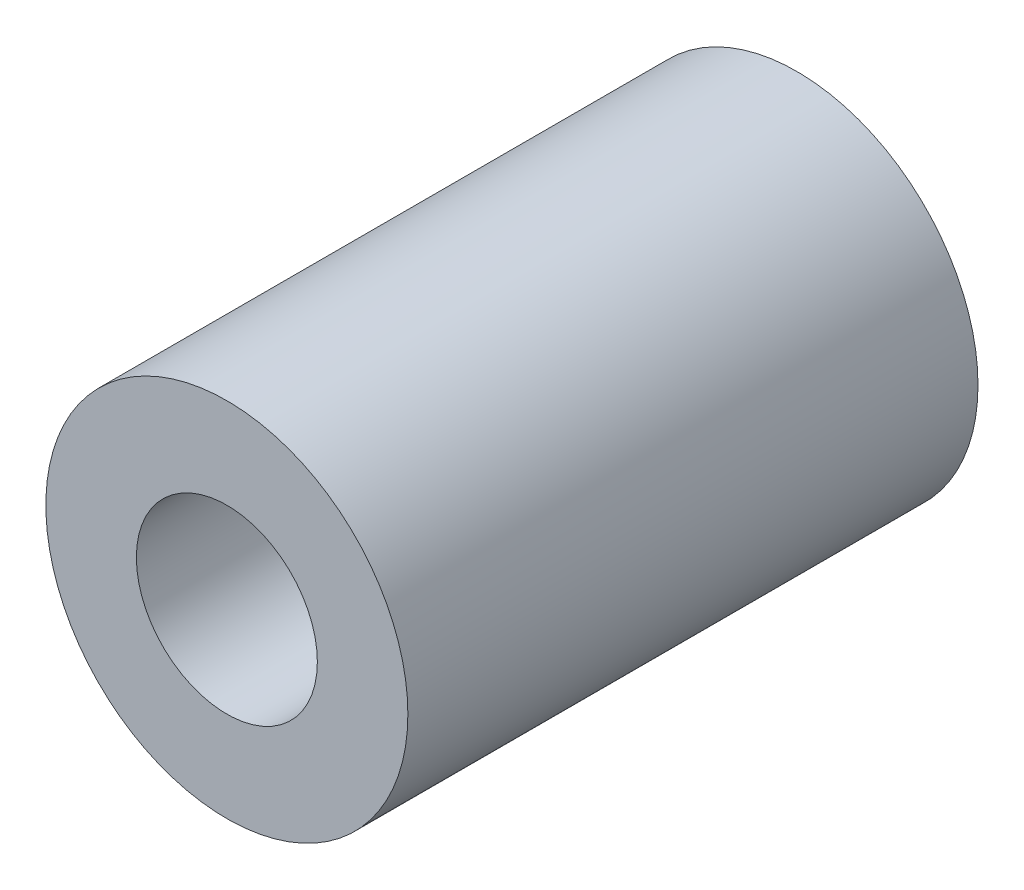
ISO-10303-21;
HEADER;
FILE_DESCRIPTION(('STEP AP214'),'2;1');
FILE_NAME('part.step','',(''),(''),'','','');
FILE_SCHEMA(('AUTOMOTIVE_DESIGN { 1 0 10303 214 1 1 1 1 }'));
ENDSEC;
DATA;
#1=APPLICATION_CONTEXT('core data for automotive mechanical design processes');
#2=APPLICATION_PROTOCOL_DEFINITION('international standard','automotive_design',2000,#1);
#3=PRODUCT_CONTEXT('',#1,'mechanical');
#4=PRODUCT('Part','Part','',(#3));
#5=PRODUCT_RELATED_PRODUCT_CATEGORY('part','',(#4));
#6=PRODUCT_DEFINITION_FORMATION('','',#4);
#7=PRODUCT_DEFINITION_CONTEXT('part definition',#1,'design');
#8=PRODUCT_DEFINITION('design','',#6,#7);
#9=PRODUCT_DEFINITION_SHAPE('','',#8);
#10=(LENGTH_UNIT() NAMED_UNIT(*) SI_UNIT(.MILLI.,.METRE.));
#11=(NAMED_UNIT(*) PLANE_ANGLE_UNIT() SI_UNIT($,.RADIAN.));
#12=(NAMED_UNIT(*) SI_UNIT($,.STERADIAN.) SOLID_ANGLE_UNIT());
#13=UNCERTAINTY_MEASURE_WITH_UNIT(LENGTH_MEASURE(1.E-05),#10,'distance_accuracy_value','');
#14=(GEOMETRIC_REPRESENTATION_CONTEXT(3) GLOBAL_UNCERTAINTY_ASSIGNED_CONTEXT((#13)) GLOBAL_UNIT_ASSIGNED_CONTEXT((#10,
#11,#12)) REPRESENTATION_CONTEXT('',''));
#15=CARTESIAN_POINT('',(0.,0.,0.));
#16=DIRECTION('',(0.,0.,1.));
#17=DIRECTION('',(1.,0.,0.));
#18=AXIS2_PLACEMENT_3D('',#15,#16,#17);
#19=CARTESIAN_POINT('',(0.,0.,10.));
#20=DIRECTION('',(0.,0.,1.));
#21=DIRECTION('',(1.,0.,0.));
#22=AXIS2_PLACEMENT_3D('',#19,#20,#21);
#23=PLANE('',#22);
#24=CARTESIAN_POINT('',(0.,0.,10.));
#25=DIRECTION('',(0.,0.,1.));
#26=DIRECTION('',(1.,0.,0.));
#27=AXIS2_PLACEMENT_3D('',#24,#25,#26);
#28=CIRCLE('',#27,3.175);
#29=CARTESIAN_POINT('',(3.175,0.,10.));
#30=VERTEX_POINT('',#29);
#31=EDGE_CURVE('E10',#30,#30,#28,.T.);
#32=ORIENTED_EDGE('',*,*,#31,.T.);
#33=EDGE_LOOP('',(#32));
#34=FACE_BOUND('',#33,.T.);
#35=CARTESIAN_POINT('',(0.,0.,10.));
#36=DIRECTION('',(0.,0.,1.));
#37=DIRECTION('',(1.,0.,0.));
#38=AXIS2_PLACEMENT_3D('',#35,#36,#37);
#39=CIRCLE('',#38,1.5875);
#40=CARTESIAN_POINT('',(1.5875,0.,10.));
#41=VERTEX_POINT('',#40);
#42=EDGE_CURVE('E41',#41,#41,#39,.T.);
#43=ORIENTED_EDGE('',*,*,#42,.F.);
#44=EDGE_LOOP('',(#43));
#45=FACE_BOUND('',#44,.T.);
#46=ADVANCED_FACE('F30',(#34,#45),#23,.T.);
#47=CARTESIAN_POINT('',(0.,0.,0.));
#48=DIRECTION('',(0.,0.,1.));
#49=DIRECTION('',(1.,0.,0.));
#50=AXIS2_PLACEMENT_3D('',#47,#48,#49);
#51=PLANE('',#50);
#52=CARTESIAN_POINT('',(0.,0.,0.));
#53=DIRECTION('',(0.,0.,1.));
#54=DIRECTION('',(1.,0.,0.));
#55=AXIS2_PLACEMENT_3D('',#52,#53,#54);
#56=CIRCLE('',#55,3.175);
#57=CARTESIAN_POINT('',(3.175,0.,0.));
#58=VERTEX_POINT('',#57);
#59=EDGE_CURVE('E34',#58,#58,#56,.T.);
#60=ORIENTED_EDGE('',*,*,#59,.F.);
#61=EDGE_LOOP('',(#60));
#62=FACE_BOUND('',#61,.T.);
#63=CARTESIAN_POINT('',(0.,0.,0.));
#64=DIRECTION('',(0.,0.,1.));
#65=DIRECTION('',(1.,0.,0.));
#66=AXIS2_PLACEMENT_3D('',#63,#64,#65);
#67=CIRCLE('',#66,1.5875);
#68=CARTESIAN_POINT('',(1.5875,0.,0.));
#69=VERTEX_POINT('',#68);
#70=EDGE_CURVE('E43',#69,#69,#67,.T.);
#71=ORIENTED_EDGE('',*,*,#70,.T.);
#72=EDGE_LOOP('',(#71));
#73=FACE_BOUND('',#72,.T.);
#74=ADVANCED_FACE('F53',(#62,#73),#51,.F.);
#75=CARTESIAN_POINT('',(0.,0.,10.));
#76=DIRECTION('',(0.,0.,-1.));
#77=DIRECTION('',(-1.,0.,0.));
#78=AXIS2_PLACEMENT_3D('',#75,#76,#77);
#79=CYLINDRICAL_SURFACE('',#78,3.175);
#80=ORIENTED_EDGE('',*,*,#31,.F.);
#81=EDGE_LOOP('',(#80));
#82=FACE_BOUND('',#81,.T.);
#83=ORIENTED_EDGE('',*,*,#59,.T.);
#84=EDGE_LOOP('',(#83));
#85=FACE_BOUND('',#84,.T.);
#86=ADVANCED_FACE('F32',(#82,#85),#79,.T.);
#87=CARTESIAN_POINT('',(0.,0.,10.));
#88=DIRECTION('',(0.,0.,-1.));
#89=DIRECTION('',(-1.,0.,0.));
#90=AXIS2_PLACEMENT_3D('',#87,#88,#89);
#91=CYLINDRICAL_SURFACE('',#90,1.5875);
#92=ORIENTED_EDGE('',*,*,#42,.T.);
#93=EDGE_LOOP('',(#92));
#94=FACE_BOUND('',#93,.T.);
#95=ORIENTED_EDGE('',*,*,#70,.F.);
#96=EDGE_LOOP('',(#95));
#97=FACE_BOUND('',#96,.T.);
#98=ADVANCED_FACE('F49',(#94,#97),#91,.F.);
#99=CLOSED_SHELL('',(#46,#74,#86,#98));
#100=MANIFOLD_SOLID_BREP('B2',#99);
#101=ADVANCED_BREP_SHAPE_REPRESENTATION('',(#18,#100),#14);
#102=SHAPE_DEFINITION_REPRESENTATION(#9,#101);
ENDSEC;
END-ISO-10303-21;
